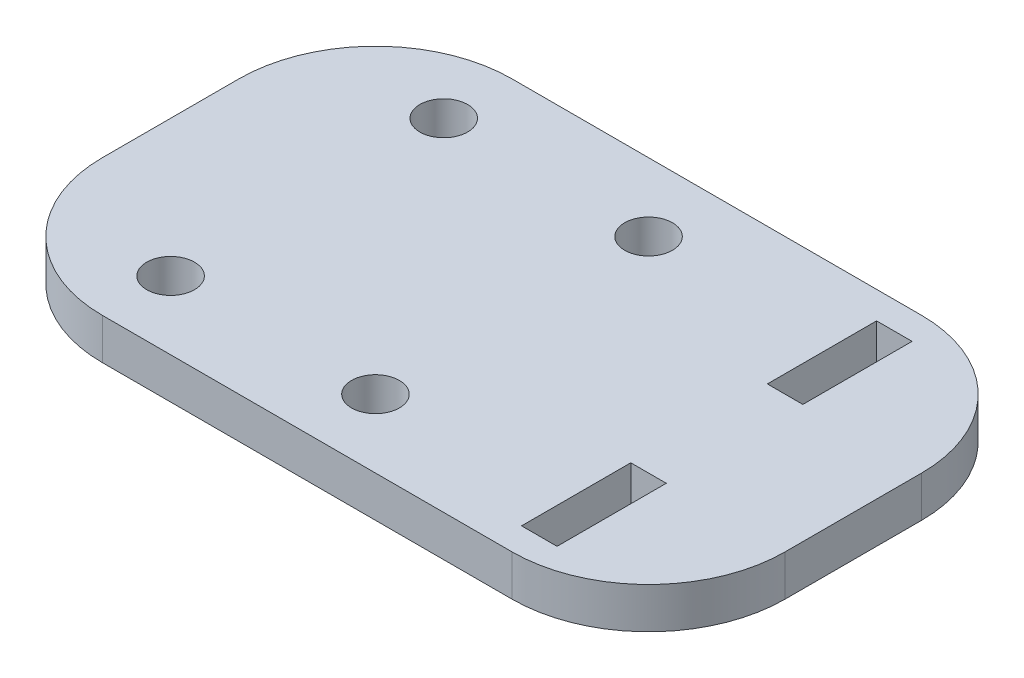
ISO-10303-21;
HEADER;
FILE_DESCRIPTION(('STEP AP214'),'2;1');
FILE_NAME('part.step','',(''),(''),'','','');
FILE_SCHEMA(('AUTOMOTIVE_DESIGN { 1 0 10303 214 1 1 1 1 }'));
ENDSEC;
DATA;
#1=APPLICATION_CONTEXT('core data for automotive mechanical design processes');
#2=APPLICATION_PROTOCOL_DEFINITION('international standard','automotive_design',2000,#1);
#3=PRODUCT_CONTEXT('',#1,'mechanical');
#4=PRODUCT('Part','Part','',(#3));
#5=PRODUCT_RELATED_PRODUCT_CATEGORY('part','',(#4));
#6=PRODUCT_DEFINITION_FORMATION('','',#4);
#7=PRODUCT_DEFINITION_CONTEXT('part definition',#1,'design');
#8=PRODUCT_DEFINITION('design','',#6,#7);
#9=PRODUCT_DEFINITION_SHAPE('','',#8);
#10=(LENGTH_UNIT() NAMED_UNIT(*) SI_UNIT(.MILLI.,.METRE.));
#11=(NAMED_UNIT(*) PLANE_ANGLE_UNIT() SI_UNIT($,.RADIAN.));
#12=(NAMED_UNIT(*) SI_UNIT($,.STERADIAN.) SOLID_ANGLE_UNIT());
#13=UNCERTAINTY_MEASURE_WITH_UNIT(LENGTH_MEASURE(1.E-05),#10,'distance_accuracy_value','');
#14=(GEOMETRIC_REPRESENTATION_CONTEXT(3) GLOBAL_UNCERTAINTY_ASSIGNED_CONTEXT((#13)) GLOBAL_UNIT_ASSIGNED_CONTEXT((#10,
#11,#12)) REPRESENTATION_CONTEXT('',''));
#15=CARTESIAN_POINT('',(0.,0.,0.));
#16=DIRECTION('',(0.,0.,1.));
#17=DIRECTION('',(1.,0.,0.));
#18=AXIS2_PLACEMENT_3D('',#15,#16,#17);
#19=CARTESIAN_POINT('',(0.,3.,0.));
#20=DIRECTION('',(0.,1.,0.));
#21=DIRECTION('',(0.,0.,1.));
#22=AXIS2_PLACEMENT_3D('',#19,#20,#21);
#23=PLANE('',#22);
#24=CARTESIAN_POINT('',(0.,3.,10.));
#25=DIRECTION('',(0.,1.,0.));
#26=DIRECTION('',(0.,0.,-1.));
#27=AXIS2_PLACEMENT_3D('',#24,#25,#26);
#28=CIRCLE('',#27,1.75);
#29=CARTESIAN_POINT('',(0.,3.,8.25));
#30=VERTEX_POINT('',#29);
#31=EDGE_CURVE('E538',#30,#30,#28,.T.);
#32=ORIENTED_EDGE('',*,*,#31,.F.);
#33=EDGE_LOOP('',(#32));
#34=FACE_BOUND('',#33,.T.);
#35=DIRECTION('',(-1.,0.,0.));
#36=VECTOR('',#35,1.);
#37=CARTESIAN_POINT('',(16.3,3.,5.));
#38=LINE('',#37,#36);
#39=CARTESIAN_POINT('',(16.3,3.,5.));
#40=VERTEX_POINT('',#39);
#41=CARTESIAN_POINT('',(13.7,3.,5.));
#42=VERTEX_POINT('',#41);
#43=EDGE_CURVE('E157',#40,#42,#38,.T.);
#44=ORIENTED_EDGE('',*,*,#43,.F.);
#45=DIRECTION('',(0.,0.,-1.));
#46=VECTOR('',#45,1.);
#47=CARTESIAN_POINT('',(16.3,3.,13.));
#48=LINE('',#47,#46);
#49=CARTESIAN_POINT('',(16.3,3.,13.));
#50=VERTEX_POINT('',#49);
#51=EDGE_CURVE('E147',#50,#40,#48,.T.);
#52=ORIENTED_EDGE('',*,*,#51,.F.);
#53=DIRECTION('',(1.,0.,0.));
#54=VECTOR('',#53,1.);
#55=CARTESIAN_POINT('',(16.3,3.,13.));
#56=LINE('',#55,#54);
#57=CARTESIAN_POINT('',(13.7,3.,13.));
#58=VERTEX_POINT('',#57);
#59=EDGE_CURVE('E173',#58,#50,#56,.T.);
#60=ORIENTED_EDGE('',*,*,#59,.F.);
#61=DIRECTION('',(0.,0.,1.));
#62=VECTOR('',#61,1.);
#63=CARTESIAN_POINT('',(13.7,3.,13.));
#64=LINE('',#63,#62);
#65=EDGE_CURVE('E171',#42,#58,#64,.T.);
#66=ORIENTED_EDGE('',*,*,#65,.F.);
#67=EDGE_LOOP('',(#44,#52,#60,#66));
#68=FACE_BOUND('',#67,.T.);
#69=DIRECTION('',(-1.,0.,0.));
#70=VECTOR('',#69,1.);
#71=CARTESIAN_POINT('',(16.3,3.,-13.));
#72=LINE('',#71,#70);
#73=CARTESIAN_POINT('',(16.3,3.,-13.));
#74=VERTEX_POINT('',#73);
#75=CARTESIAN_POINT('',(13.7,3.,-13.));
#76=VERTEX_POINT('',#75);
#77=EDGE_CURVE('E199',#74,#76,#72,.T.);
#78=ORIENTED_EDGE('',*,*,#77,.F.);
#79=DIRECTION('',(0.,0.,-1.));
#80=VECTOR('',#79,1.);
#81=CARTESIAN_POINT('',(16.3,3.,-13.));
#82=LINE('',#81,#80);
#83=CARTESIAN_POINT('',(16.3,3.,-5.));
#84=VERTEX_POINT('',#83);
#85=EDGE_CURVE('E197',#84,#74,#82,.T.);
#86=ORIENTED_EDGE('',*,*,#85,.F.);
#87=DIRECTION('',(1.,0.,0.));
#88=VECTOR('',#87,1.);
#89=CARTESIAN_POINT('',(16.3,3.,-5.));
#90=LINE('',#89,#88);
#91=CARTESIAN_POINT('',(13.7,3.,-5.));
#92=VERTEX_POINT('',#91);
#93=EDGE_CURVE('E205',#92,#84,#90,.T.);
#94=ORIENTED_EDGE('',*,*,#93,.F.);
#95=DIRECTION('',(0.,0.,1.));
#96=VECTOR('',#95,1.);
#97=CARTESIAN_POINT('',(13.7,3.,-13.));
#98=LINE('',#97,#96);
#99=EDGE_CURVE('E202',#76,#92,#98,.T.);
#100=ORIENTED_EDGE('',*,*,#99,.F.);
#101=EDGE_LOOP('',(#78,#86,#94,#100));
#102=FACE_BOUND('',#101,.T.);
#103=DIRECTION('',(-1.,0.,0.));
#104=VECTOR('',#103,1.);
#105=CARTESIAN_POINT('',(-25.,3.,-15.));
#106=LINE('',#105,#104);
#107=CARTESIAN_POINT('',(15.,3.,-15.));
#108=VERTEX_POINT('',#107);
#109=CARTESIAN_POINT('',(-15.,3.,-15.));
#110=VERTEX_POINT('',#109);
#111=EDGE_CURVE('E236',#108,#110,#106,.T.);
#112=ORIENTED_EDGE('',*,*,#111,.T.);
#113=CARTESIAN_POINT('',(-15.,3.,-5.));
#114=DIRECTION('',(0.,1.,0.));
#115=DIRECTION('',(0.,0.,1.));
#116=AXIS2_PLACEMENT_3D('',#113,#114,#115);
#117=CIRCLE('',#116,10.);
#118=CARTESIAN_POINT('',(-25.,3.,-5.));
#119=VERTEX_POINT('',#118);
#120=EDGE_CURVE('E271',#110,#119,#117,.T.);
#121=ORIENTED_EDGE('',*,*,#120,.T.);
#122=DIRECTION('',(0.,0.,1.));
#123=VECTOR('',#122,1.);
#124=CARTESIAN_POINT('',(-25.,3.,-15.));
#125=LINE('',#124,#123);
#126=CARTESIAN_POINT('',(-25.,3.,5.));
#127=VERTEX_POINT('',#126);
#128=EDGE_CURVE('E228',#119,#127,#125,.T.);
#129=ORIENTED_EDGE('',*,*,#128,.T.);
#130=CARTESIAN_POINT('',(-15.,3.,5.));
#131=DIRECTION('',(0.,1.,0.));
#132=DIRECTION('',(0.,0.,1.));
#133=AXIS2_PLACEMENT_3D('',#130,#131,#132);
#134=CIRCLE('',#133,10.);
#135=CARTESIAN_POINT('',(-15.,3.,15.));
#136=VERTEX_POINT('',#135);
#137=EDGE_CURVE('E269',#127,#136,#134,.T.);
#138=ORIENTED_EDGE('',*,*,#137,.T.);
#139=DIRECTION('',(1.,0.,0.));
#140=VECTOR('',#139,1.);
#141=CARTESIAN_POINT('',(-25.,3.,15.));
#142=LINE('',#141,#140);
#143=CARTESIAN_POINT('',(15.,3.,15.));
#144=VERTEX_POINT('',#143);
#145=EDGE_CURVE('E231',#136,#144,#142,.T.);
#146=ORIENTED_EDGE('',*,*,#145,.T.);
#147=CARTESIAN_POINT('',(15.,3.,5.));
#148=DIRECTION('',(0.,1.,0.));
#149=DIRECTION('',(0.,0.,1.));
#150=AXIS2_PLACEMENT_3D('',#147,#148,#149);
#151=CIRCLE('',#150,10.);
#152=CARTESIAN_POINT('',(25.,3.,5.));
#153=VERTEX_POINT('',#152);
#154=EDGE_CURVE('E53',#144,#153,#151,.T.);
#155=ORIENTED_EDGE('',*,*,#154,.T.);
#156=DIRECTION('',(0.,0.,-1.));
#157=VECTOR('',#156,1.);
#158=CARTESIAN_POINT('',(25.,3.,-15.));
#159=LINE('',#158,#157);
#160=CARTESIAN_POINT('',(25.,3.,-5.));
#161=VERTEX_POINT('',#160);
#162=EDGE_CURVE('E234',#153,#161,#159,.T.);
#163=ORIENTED_EDGE('',*,*,#162,.T.);
#164=CARTESIAN_POINT('',(15.,3.,-5.));
#165=DIRECTION('',(0.,1.,0.));
#166=DIRECTION('',(0.,0.,1.));
#167=AXIS2_PLACEMENT_3D('',#164,#165,#166);
#168=CIRCLE('',#167,10.);
#169=EDGE_CURVE('E267',#161,#108,#168,.T.);
#170=ORIENTED_EDGE('',*,*,#169,.T.);
#171=EDGE_LOOP('',(#112,#121,#129,#138,#146,#155,#163,#170));
#172=FACE_BOUND('',#171,.T.);
#173=CARTESIAN_POINT('',(-15.,3.,-10.));
#174=DIRECTION('',(0.,1.,0.));
#175=DIRECTION('',(0.,0.,1.));
#176=AXIS2_PLACEMENT_3D('',#173,#174,#175);
#177=CIRCLE('',#176,1.75);
#178=CARTESIAN_POINT('',(-15.,3.,-8.25));
#179=VERTEX_POINT('',#178);
#180=EDGE_CURVE('E191',#179,#179,#177,.T.);
#181=ORIENTED_EDGE('',*,*,#180,.F.);
#182=EDGE_LOOP('',(#181));
#183=FACE_BOUND('',#182,.T.);
#184=CARTESIAN_POINT('',(0.,3.,-10.));
#185=DIRECTION('',(0.,1.,0.));
#186=DIRECTION('',(0.,0.,1.));
#187=AXIS2_PLACEMENT_3D('',#184,#185,#186);
#188=CIRCLE('',#187,1.75);
#189=CARTESIAN_POINT('',(0.,3.,-8.25));
#190=VERTEX_POINT('',#189);
#191=EDGE_CURVE('E180',#190,#190,#188,.T.);
#192=ORIENTED_EDGE('',*,*,#191,.F.);
#193=EDGE_LOOP('',(#192));
#194=FACE_BOUND('',#193,.T.);
#195=CARTESIAN_POINT('',(-15.,3.,10.));
#196=DIRECTION('',(0.,1.,0.));
#197=DIRECTION('',(0.,0.,-1.));
#198=AXIS2_PLACEMENT_3D('',#195,#196,#197);
#199=CIRCLE('',#198,1.75);
#200=CARTESIAN_POINT('',(-15.,3.,8.25));
#201=VERTEX_POINT('',#200);
#202=EDGE_CURVE('E532',#201,#201,#199,.T.);
#203=ORIENTED_EDGE('',*,*,#202,.F.);
#204=EDGE_LOOP('',(#203));
#205=FACE_BOUND('',#204,.T.);
#206=ADVANCED_FACE('F33',(#34,#68,#102,#172,#183,#194,#205),#23,.T.);
#207=CARTESIAN_POINT('',(0.,0.,0.));
#208=DIRECTION('',(0.,1.,0.));
#209=DIRECTION('',(0.,0.,1.));
#210=AXIS2_PLACEMENT_3D('',#207,#208,#209);
#211=PLANE('',#210);
#212=CARTESIAN_POINT('',(0.,0.,10.));
#213=DIRECTION('',(0.,1.,0.));
#214=DIRECTION('',(0.,0.,-1.));
#215=AXIS2_PLACEMENT_3D('',#212,#213,#214);
#216=CIRCLE('',#215,1.75);
#217=CARTESIAN_POINT('',(0.,0.,8.25));
#218=VERTEX_POINT('',#217);
#219=EDGE_CURVE('E535',#218,#218,#216,.T.);
#220=ORIENTED_EDGE('',*,*,#219,.T.);
#221=EDGE_LOOP('',(#220));
#222=FACE_BOUND('',#221,.T.);
#223=DIRECTION('',(0.,0.,-1.));
#224=VECTOR('',#223,1.);
#225=CARTESIAN_POINT('',(16.3,0.,13.));
#226=LINE('',#225,#224);
#227=CARTESIAN_POINT('',(16.3,0.,13.));
#228=VERTEX_POINT('',#227);
#229=CARTESIAN_POINT('',(16.3,0.,5.));
#230=VERTEX_POINT('',#229);
#231=EDGE_CURVE('E178',#228,#230,#226,.T.);
#232=ORIENTED_EDGE('',*,*,#231,.T.);
#233=DIRECTION('',(-1.,0.,0.));
#234=VECTOR('',#233,1.);
#235=CARTESIAN_POINT('',(16.3,0.,5.));
#236=LINE('',#235,#234);
#237=CARTESIAN_POINT('',(13.7,0.,5.));
#238=VERTEX_POINT('',#237);
#239=EDGE_CURVE('E164',#230,#238,#236,.T.);
#240=ORIENTED_EDGE('',*,*,#239,.T.);
#241=DIRECTION('',(0.,0.,1.));
#242=VECTOR('',#241,1.);
#243=CARTESIAN_POINT('',(13.7,0.,13.));
#244=LINE('',#243,#242);
#245=CARTESIAN_POINT('',(13.7,0.,13.));
#246=VERTEX_POINT('',#245);
#247=EDGE_CURVE('E182',#238,#246,#244,.T.);
#248=ORIENTED_EDGE('',*,*,#247,.T.);
#249=DIRECTION('',(1.,0.,0.));
#250=VECTOR('',#249,1.);
#251=CARTESIAN_POINT('',(16.3,0.,13.));
#252=LINE('',#251,#250);
#253=EDGE_CURVE('E158',#246,#228,#252,.T.);
#254=ORIENTED_EDGE('',*,*,#253,.T.);
#255=EDGE_LOOP('',(#232,#240,#248,#254));
#256=FACE_BOUND('',#255,.T.);
#257=DIRECTION('',(0.,0.,-1.));
#258=VECTOR('',#257,1.);
#259=CARTESIAN_POINT('',(16.3,0.,-13.));
#260=LINE('',#259,#258);
#261=CARTESIAN_POINT('',(16.3,0.,-5.));
#262=VERTEX_POINT('',#261);
#263=CARTESIAN_POINT('',(16.3,0.,-13.));
#264=VERTEX_POINT('',#263);
#265=EDGE_CURVE('E194',#262,#264,#260,.T.);
#266=ORIENTED_EDGE('',*,*,#265,.T.);
#267=DIRECTION('',(-1.,0.,0.));
#268=VECTOR('',#267,1.);
#269=CARTESIAN_POINT('',(16.3,0.,-13.));
#270=LINE('',#269,#268);
#271=CARTESIAN_POINT('',(13.7,0.,-13.));
#272=VERTEX_POINT('',#271);
#273=EDGE_CURVE('E210',#264,#272,#270,.T.);
#274=ORIENTED_EDGE('',*,*,#273,.T.);
#275=DIRECTION('',(0.,0.,1.));
#276=VECTOR('',#275,1.);
#277=CARTESIAN_POINT('',(13.7,0.,-13.));
#278=LINE('',#277,#276);
#279=CARTESIAN_POINT('',(13.7,0.,-5.));
#280=VERTEX_POINT('',#279);
#281=EDGE_CURVE('E213',#272,#280,#278,.T.);
#282=ORIENTED_EDGE('',*,*,#281,.T.);
#283=DIRECTION('',(1.,0.,0.));
#284=VECTOR('',#283,1.);
#285=CARTESIAN_POINT('',(16.3,0.,-5.));
#286=LINE('',#285,#284);
#287=EDGE_CURVE('E200',#280,#262,#286,.T.);
#288=ORIENTED_EDGE('',*,*,#287,.T.);
#289=EDGE_LOOP('',(#266,#274,#282,#288));
#290=FACE_BOUND('',#289,.T.);
#291=DIRECTION('',(0.,0.,1.));
#292=VECTOR('',#291,1.);
#293=CARTESIAN_POINT('',(-25.,0.,-15.));
#294=LINE('',#293,#292);
#295=CARTESIAN_POINT('',(-25.,0.,-5.));
#296=VERTEX_POINT('',#295);
#297=CARTESIAN_POINT('',(-25.,0.,5.));
#298=VERTEX_POINT('',#297);
#299=EDGE_CURVE('E227',#296,#298,#294,.T.);
#300=ORIENTED_EDGE('',*,*,#299,.F.);
#301=CARTESIAN_POINT('',(-15.,0.,-5.));
#302=DIRECTION('',(0.,1.,0.));
#303=DIRECTION('',(0.,0.,1.));
#304=AXIS2_PLACEMENT_3D('',#301,#302,#303);
#305=CIRCLE('',#304,10.);
#306=CARTESIAN_POINT('',(-15.,0.,-15.));
#307=VERTEX_POINT('',#306);
#308=EDGE_CURVE('E259',#296,#307,#305,.F.);
#309=ORIENTED_EDGE('',*,*,#308,.T.);
#310=DIRECTION('',(-1.,0.,0.));
#311=VECTOR('',#310,1.);
#312=CARTESIAN_POINT('',(-25.,0.,-15.));
#313=LINE('',#312,#311);
#314=CARTESIAN_POINT('',(15.,0.,-15.));
#315=VERTEX_POINT('',#314);
#316=EDGE_CURVE('E232',#315,#307,#313,.T.);
#317=ORIENTED_EDGE('',*,*,#316,.F.);
#318=CARTESIAN_POINT('',(15.,0.,-5.));
#319=DIRECTION('',(0.,1.,0.));
#320=DIRECTION('',(0.,0.,1.));
#321=AXIS2_PLACEMENT_3D('',#318,#319,#320);
#322=CIRCLE('',#321,10.);
#323=CARTESIAN_POINT('',(25.,0.,-5.));
#324=VERTEX_POINT('',#323);
#325=EDGE_CURVE('E255',#315,#324,#322,.F.);
#326=ORIENTED_EDGE('',*,*,#325,.T.);
#327=DIRECTION('',(0.,0.,-1.));
#328=VECTOR('',#327,1.);
#329=CARTESIAN_POINT('',(25.,0.,-15.));
#330=LINE('',#329,#328);
#331=CARTESIAN_POINT('',(25.,0.,5.));
#332=VERTEX_POINT('',#331);
#333=EDGE_CURVE('E245',#332,#324,#330,.T.);
#334=ORIENTED_EDGE('',*,*,#333,.F.);
#335=CARTESIAN_POINT('',(15.,0.,5.));
#336=DIRECTION('',(0.,1.,0.));
#337=DIRECTION('',(0.,0.,1.));
#338=AXIS2_PLACEMENT_3D('',#335,#336,#337);
#339=CIRCLE('',#338,10.);
#340=CARTESIAN_POINT('',(15.,0.,15.));
#341=VERTEX_POINT('',#340);
#342=EDGE_CURVE('E253',#332,#341,#339,.F.);
#343=ORIENTED_EDGE('',*,*,#342,.T.);
#344=DIRECTION('',(1.,0.,0.));
#345=VECTOR('',#344,1.);
#346=CARTESIAN_POINT('',(-25.,0.,15.));
#347=LINE('',#346,#345);
#348=CARTESIAN_POINT('',(-15.,0.,15.));
#349=VERTEX_POINT('',#348);
#350=EDGE_CURVE('E242',#349,#341,#347,.T.);
#351=ORIENTED_EDGE('',*,*,#350,.F.);
#352=CARTESIAN_POINT('',(-15.,0.,5.));
#353=DIRECTION('',(0.,1.,0.));
#354=DIRECTION('',(0.,0.,1.));
#355=AXIS2_PLACEMENT_3D('',#352,#353,#354);
#356=CIRCLE('',#355,10.);
#357=EDGE_CURVE('E257',#349,#298,#356,.F.);
#358=ORIENTED_EDGE('',*,*,#357,.T.);
#359=EDGE_LOOP('',(#300,#309,#317,#326,#334,#343,#351,#358));
#360=FACE_BOUND('',#359,.T.);
#361=CARTESIAN_POINT('',(-15.,0.,-10.));
#362=DIRECTION('',(0.,1.,0.));
#363=DIRECTION('',(0.,0.,1.));
#364=AXIS2_PLACEMENT_3D('',#361,#362,#363);
#365=CIRCLE('',#364,1.75);
#366=CARTESIAN_POINT('',(-15.,0.,-8.25));
#367=VERTEX_POINT('',#366);
#368=EDGE_CURVE('E165',#367,#367,#365,.T.);
#369=ORIENTED_EDGE('',*,*,#368,.T.);
#370=EDGE_LOOP('',(#369));
#371=FACE_BOUND('',#370,.T.);
#372=CARTESIAN_POINT('',(0.,0.,-10.));
#373=DIRECTION('',(0.,1.,0.));
#374=DIRECTION('',(0.,0.,1.));
#375=AXIS2_PLACEMENT_3D('',#372,#373,#374);
#376=CIRCLE('',#375,1.75);
#377=CARTESIAN_POINT('',(0.,0.,-8.25));
#378=VERTEX_POINT('',#377);
#379=EDGE_CURVE('E527',#378,#378,#376,.T.);
#380=ORIENTED_EDGE('',*,*,#379,.T.);
#381=EDGE_LOOP('',(#380));
#382=FACE_BOUND('',#381,.T.);
#383=CARTESIAN_POINT('',(-15.,0.,10.));
#384=DIRECTION('',(0.,1.,0.));
#385=DIRECTION('',(0.,0.,-1.));
#386=AXIS2_PLACEMENT_3D('',#383,#384,#385);
#387=CIRCLE('',#386,1.75);
#388=CARTESIAN_POINT('',(-15.,0.,8.25));
#389=VERTEX_POINT('',#388);
#390=EDGE_CURVE('E530',#389,#389,#387,.T.);
#391=ORIENTED_EDGE('',*,*,#390,.T.);
#392=EDGE_LOOP('',(#391));
#393=FACE_BOUND('',#392,.T.);
#394=ADVANCED_FACE('F284',(#222,#256,#290,#360,#371,#382,#393),#211,.F.);
#395=CARTESIAN_POINT('',(-25.,3.,-15.));
#396=DIRECTION('',(1.,0.,0.));
#397=DIRECTION('',(0.,0.,-1.));
#398=AXIS2_PLACEMENT_3D('',#395,#396,#397);
#399=PLANE('',#398);
#400=ORIENTED_EDGE('',*,*,#128,.F.);
#401=DIRECTION('',(0.,-1.,0.));
#402=VECTOR('',#401,1.);
#403=CARTESIAN_POINT('',(-25.,3.,-5.));
#404=LINE('',#403,#402);
#405=EDGE_CURVE('E250',#119,#296,#404,.T.);
#406=ORIENTED_EDGE('',*,*,#405,.T.);
#407=ORIENTED_EDGE('',*,*,#299,.T.);
#408=DIRECTION('',(0.,-1.,0.));
#409=VECTOR('',#408,1.);
#410=CARTESIAN_POINT('',(-25.,3.,5.));
#411=LINE('',#410,#409);
#412=EDGE_CURVE('E239',#298,#127,#411,.F.);
#413=ORIENTED_EDGE('',*,*,#412,.T.);
#414=EDGE_LOOP('',(#400,#406,#407,#413));
#415=FACE_BOUND('',#414,.T.);
#416=ADVANCED_FACE('F303',(#415),#399,.F.);
#417=CARTESIAN_POINT('',(-25.,3.,15.));
#418=DIRECTION('',(0.,0.,-1.));
#419=DIRECTION('',(-1.,0.,0.));
#420=AXIS2_PLACEMENT_3D('',#417,#418,#419);
#421=PLANE('',#420);
#422=ORIENTED_EDGE('',*,*,#145,.F.);
#423=DIRECTION('',(0.,-1.,0.));
#424=VECTOR('',#423,1.);
#425=CARTESIAN_POINT('',(-15.,3.,15.));
#426=LINE('',#425,#424);
#427=EDGE_CURVE('E275',#136,#349,#426,.T.);
#428=ORIENTED_EDGE('',*,*,#427,.T.);
#429=ORIENTED_EDGE('',*,*,#350,.T.);
#430=DIRECTION('',(0.,-1.,0.));
#431=VECTOR('',#430,1.);
#432=CARTESIAN_POINT('',(15.,3.,15.));
#433=LINE('',#432,#431);
#434=EDGE_CURVE('E273',#341,#144,#433,.F.);
#435=ORIENTED_EDGE('',*,*,#434,.T.);
#436=EDGE_LOOP('',(#422,#428,#429,#435));
#437=FACE_BOUND('',#436,.T.);
#438=ADVANCED_FACE('F311',(#437),#421,.F.);
#439=CARTESIAN_POINT('',(25.,3.,-15.));
#440=DIRECTION('',(-1.,0.,0.));
#441=DIRECTION('',(0.,0.,1.));
#442=AXIS2_PLACEMENT_3D('',#439,#440,#441);
#443=PLANE('',#442);
#444=ORIENTED_EDGE('',*,*,#333,.T.);
#445=DIRECTION('',(0.,-1.,0.));
#446=VECTOR('',#445,1.);
#447=CARTESIAN_POINT('',(25.,3.,-5.));
#448=LINE('',#447,#446);
#449=EDGE_CURVE('E11',#324,#161,#448,.F.);
#450=ORIENTED_EDGE('',*,*,#449,.T.);
#451=ORIENTED_EDGE('',*,*,#162,.F.);
#452=DIRECTION('',(0.,-1.,0.));
#453=VECTOR('',#452,1.);
#454=CARTESIAN_POINT('',(25.,3.,5.));
#455=LINE('',#454,#453);
#456=EDGE_CURVE('E41',#153,#332,#455,.T.);
#457=ORIENTED_EDGE('',*,*,#456,.T.);
#458=EDGE_LOOP('',(#444,#450,#451,#457));
#459=FACE_BOUND('',#458,.T.);
#460=ADVANCED_FACE('F280',(#459),#443,.F.);
#461=CARTESIAN_POINT('',(-25.,3.,-15.));
#462=DIRECTION('',(0.,0.,1.));
#463=DIRECTION('',(1.,0.,0.));
#464=AXIS2_PLACEMENT_3D('',#461,#462,#463);
#465=PLANE('',#464);
#466=ORIENTED_EDGE('',*,*,#316,.T.);
#467=DIRECTION('',(0.,-1.,0.));
#468=VECTOR('',#467,1.);
#469=CARTESIAN_POINT('',(-15.,3.,-15.));
#470=LINE('',#469,#468);
#471=EDGE_CURVE('E264',#307,#110,#470,.F.);
#472=ORIENTED_EDGE('',*,*,#471,.T.);
#473=ORIENTED_EDGE('',*,*,#111,.F.);
#474=DIRECTION('',(0.,-1.,0.));
#475=VECTOR('',#474,1.);
#476=CARTESIAN_POINT('',(15.,3.,-15.));
#477=LINE('',#476,#475);
#478=EDGE_CURVE('E261',#108,#315,#477,.T.);
#479=ORIENTED_EDGE('',*,*,#478,.T.);
#480=EDGE_LOOP('',(#466,#472,#473,#479));
#481=FACE_BOUND('',#480,.T.);
#482=ADVANCED_FACE('F294',(#481),#465,.F.);
#483=CARTESIAN_POINT('',(16.3,3.,-13.));
#484=DIRECTION('',(-1.,0.,0.));
#485=DIRECTION('',(0.,0.,1.));
#486=AXIS2_PLACEMENT_3D('',#483,#484,#485);
#487=PLANE('',#486);
#488=ORIENTED_EDGE('',*,*,#265,.F.);
#489=DIRECTION('',(0.,-1.,0.));
#490=VECTOR('',#489,1.);
#491=CARTESIAN_POINT('',(16.3,3.,-5.));
#492=LINE('',#491,#490);
#493=EDGE_CURVE('E207',#84,#262,#492,.T.);
#494=ORIENTED_EDGE('',*,*,#493,.F.);
#495=ORIENTED_EDGE('',*,*,#85,.T.);
#496=DIRECTION('',(0.,-1.,0.));
#497=VECTOR('',#496,1.);
#498=CARTESIAN_POINT('',(16.3,3.,-13.));
#499=LINE('',#498,#497);
#500=EDGE_CURVE('E224',#74,#264,#499,.T.);
#501=ORIENTED_EDGE('',*,*,#500,.T.);
#502=EDGE_LOOP('',(#488,#494,#495,#501));
#503=FACE_BOUND('',#502,.T.);
#504=ADVANCED_FACE('F327',(#503),#487,.T.);
#505=CARTESIAN_POINT('',(16.3,3.,-13.));
#506=DIRECTION('',(0.,0.,1.));
#507=DIRECTION('',(1.,0.,0.));
#508=AXIS2_PLACEMENT_3D('',#505,#506,#507);
#509=PLANE('',#508);
#510=ORIENTED_EDGE('',*,*,#273,.F.);
#511=ORIENTED_EDGE('',*,*,#500,.F.);
#512=ORIENTED_EDGE('',*,*,#77,.T.);
#513=DIRECTION('',(0.,-1.,0.));
#514=VECTOR('',#513,1.);
#515=CARTESIAN_POINT('',(13.7,3.,-13.));
#516=LINE('',#515,#514);
#517=EDGE_CURVE('E222',#76,#272,#516,.T.);
#518=ORIENTED_EDGE('',*,*,#517,.T.);
#519=EDGE_LOOP('',(#510,#511,#512,#518));
#520=FACE_BOUND('',#519,.T.);
#521=ADVANCED_FACE('F448',(#520),#509,.T.);
#522=CARTESIAN_POINT('',(13.7,3.,-13.));
#523=DIRECTION('',(1.,0.,0.));
#524=DIRECTION('',(0.,0.,-1.));
#525=AXIS2_PLACEMENT_3D('',#522,#523,#524);
#526=PLANE('',#525);
#527=ORIENTED_EDGE('',*,*,#281,.F.);
#528=ORIENTED_EDGE('',*,*,#517,.F.);
#529=ORIENTED_EDGE('',*,*,#99,.T.);
#530=DIRECTION('',(0.,-1.,0.));
#531=VECTOR('',#530,1.);
#532=CARTESIAN_POINT('',(13.7,3.,-5.));
#533=LINE('',#532,#531);
#534=EDGE_CURVE('E220',#92,#280,#533,.T.);
#535=ORIENTED_EDGE('',*,*,#534,.T.);
#536=EDGE_LOOP('',(#527,#528,#529,#535));
#537=FACE_BOUND('',#536,.T.);
#538=ADVANCED_FACE('F439',(#537),#526,.T.);
#539=CARTESIAN_POINT('',(16.3,3.,-5.));
#540=DIRECTION('',(0.,0.,-1.));
#541=DIRECTION('',(-1.,0.,0.));
#542=AXIS2_PLACEMENT_3D('',#539,#540,#541);
#543=PLANE('',#542);
#544=ORIENTED_EDGE('',*,*,#287,.F.);
#545=ORIENTED_EDGE('',*,*,#534,.F.);
#546=ORIENTED_EDGE('',*,*,#93,.T.);
#547=ORIENTED_EDGE('',*,*,#493,.T.);
#548=EDGE_LOOP('',(#544,#545,#546,#547));
#549=FACE_BOUND('',#548,.T.);
#550=ADVANCED_FACE('F430',(#549),#543,.T.);
#551=CARTESIAN_POINT('',(-15.,3.,-10.));
#552=DIRECTION('',(0.,-1.,0.));
#553=DIRECTION('',(0.,0.,-1.));
#554=AXIS2_PLACEMENT_3D('',#551,#552,#553);
#555=CYLINDRICAL_SURFACE('',#554,1.75);
#556=ORIENTED_EDGE('',*,*,#180,.T.);
#557=EDGE_LOOP('',(#556));
#558=FACE_BOUND('',#557,.T.);
#559=ORIENTED_EDGE('',*,*,#368,.F.);
#560=EDGE_LOOP('',(#559));
#561=FACE_BOUND('',#560,.T.);
#562=ADVANCED_FACE('F422',(#558,#561),#555,.F.);
#563=CARTESIAN_POINT('',(16.3,3.,13.));
#564=DIRECTION('',(-1.,0.,0.));
#565=DIRECTION('',(0.,0.,1.));
#566=AXIS2_PLACEMENT_3D('',#563,#564,#565);
#567=PLANE('',#566);
#568=ORIENTED_EDGE('',*,*,#231,.F.);
#569=DIRECTION('',(0.,-1.,0.));
#570=VECTOR('',#569,1.);
#571=CARTESIAN_POINT('',(16.3,3.,13.));
#572=LINE('',#571,#570);
#573=EDGE_CURVE('E153',#50,#228,#572,.T.);
#574=ORIENTED_EDGE('',*,*,#573,.F.);
#575=ORIENTED_EDGE('',*,*,#51,.T.);
#576=DIRECTION('',(0.,-1.,0.));
#577=VECTOR('',#576,1.);
#578=CARTESIAN_POINT('',(16.3,3.,5.));
#579=LINE('',#578,#577);
#580=EDGE_CURVE('E150',#40,#230,#579,.T.);
#581=ORIENTED_EDGE('',*,*,#580,.T.);
#582=EDGE_LOOP('',(#568,#574,#575,#581));
#583=FACE_BOUND('',#582,.T.);
#584=ADVANCED_FACE('F149',(#583),#567,.T.);
#585=CARTESIAN_POINT('',(16.3,3.,5.));
#586=DIRECTION('',(0.,0.,1.));
#587=DIRECTION('',(1.,0.,0.));
#588=AXIS2_PLACEMENT_3D('',#585,#586,#587);
#589=PLANE('',#588);
#590=ORIENTED_EDGE('',*,*,#239,.F.);
#591=ORIENTED_EDGE('',*,*,#580,.F.);
#592=ORIENTED_EDGE('',*,*,#43,.T.);
#593=DIRECTION('',(0.,-1.,0.));
#594=VECTOR('',#593,1.);
#595=CARTESIAN_POINT('',(13.7,3.,5.));
#596=LINE('',#595,#594);
#597=EDGE_CURVE('E166',#42,#238,#596,.T.);
#598=ORIENTED_EDGE('',*,*,#597,.T.);
#599=EDGE_LOOP('',(#590,#591,#592,#598));
#600=FACE_BOUND('',#599,.T.);
#601=ADVANCED_FACE('F161',(#600),#589,.T.);
#602=CARTESIAN_POINT('',(13.7,3.,13.));
#603=DIRECTION('',(1.,0.,0.));
#604=DIRECTION('',(0.,0.,-1.));
#605=AXIS2_PLACEMENT_3D('',#602,#603,#604);
#606=PLANE('',#605);
#607=ORIENTED_EDGE('',*,*,#247,.F.);
#608=ORIENTED_EDGE('',*,*,#597,.F.);
#609=ORIENTED_EDGE('',*,*,#65,.T.);
#610=DIRECTION('',(0.,-1.,0.));
#611=VECTOR('',#610,1.);
#612=CARTESIAN_POINT('',(13.7,3.,13.));
#613=LINE('',#612,#611);
#614=EDGE_CURVE('E188',#58,#246,#613,.T.);
#615=ORIENTED_EDGE('',*,*,#614,.T.);
#616=EDGE_LOOP('',(#607,#608,#609,#615));
#617=FACE_BOUND('',#616,.T.);
#618=ADVANCED_FACE('F398',(#617),#606,.T.);
#619=CARTESIAN_POINT('',(16.3,3.,13.));
#620=DIRECTION('',(0.,0.,-1.));
#621=DIRECTION('',(-1.,0.,0.));
#622=AXIS2_PLACEMENT_3D('',#619,#620,#621);
#623=PLANE('',#622);
#624=ORIENTED_EDGE('',*,*,#253,.F.);
#625=ORIENTED_EDGE('',*,*,#614,.F.);
#626=ORIENTED_EDGE('',*,*,#59,.T.);
#627=ORIENTED_EDGE('',*,*,#573,.T.);
#628=EDGE_LOOP('',(#624,#625,#626,#627));
#629=FACE_BOUND('',#628,.T.);
#630=ADVANCED_FACE('F389',(#629),#623,.T.);
#631=CARTESIAN_POINT('',(0.,3.,-10.));
#632=DIRECTION('',(0.,-1.,0.));
#633=DIRECTION('',(0.,0.,-1.));
#634=AXIS2_PLACEMENT_3D('',#631,#632,#633);
#635=CYLINDRICAL_SURFACE('',#634,1.75);
#636=ORIENTED_EDGE('',*,*,#191,.T.);
#637=EDGE_LOOP('',(#636));
#638=FACE_BOUND('',#637,.T.);
#639=ORIENTED_EDGE('',*,*,#379,.F.);
#640=EDGE_LOOP('',(#639));
#641=FACE_BOUND('',#640,.T.);
#642=ADVANCED_FACE('F380',(#638,#641),#635,.F.);
#643=CARTESIAN_POINT('',(0.,3.,10.));
#644=DIRECTION('',(0.,-1.,0.));
#645=DIRECTION('',(0.,0.,-1.));
#646=AXIS2_PLACEMENT_3D('',#643,#644,#645);
#647=CYLINDRICAL_SURFACE('',#646,1.75);
#648=ORIENTED_EDGE('',*,*,#31,.T.);
#649=EDGE_LOOP('',(#648));
#650=FACE_BOUND('',#649,.T.);
#651=ORIENTED_EDGE('',*,*,#219,.F.);
#652=EDGE_LOOP('',(#651));
#653=FACE_BOUND('',#652,.T.);
#654=ADVANCED_FACE('F371',(#650,#653),#647,.F.);
#655=CARTESIAN_POINT('',(-15.,3.,10.));
#656=DIRECTION('',(0.,-1.,0.));
#657=DIRECTION('',(0.,0.,-1.));
#658=AXIS2_PLACEMENT_3D('',#655,#656,#657);
#659=CYLINDRICAL_SURFACE('',#658,1.75);
#660=ORIENTED_EDGE('',*,*,#202,.T.);
#661=EDGE_LOOP('',(#660));
#662=FACE_BOUND('',#661,.T.);
#663=ORIENTED_EDGE('',*,*,#390,.F.);
#664=EDGE_LOOP('',(#663));
#665=FACE_BOUND('',#664,.T.);
#666=ADVANCED_FACE('F340',(#662,#665),#659,.F.);
#667=CARTESIAN_POINT('',(-15.,3.,-5.));
#668=DIRECTION('',(0.,-1.,0.));
#669=DIRECTION('',(0.,0.,-1.));
#670=AXIS2_PLACEMENT_3D('',#667,#668,#669);
#671=CYLINDRICAL_SURFACE('',#670,10.);
#672=ORIENTED_EDGE('',*,*,#120,.F.);
#673=ORIENTED_EDGE('',*,*,#471,.F.);
#674=ORIENTED_EDGE('',*,*,#308,.F.);
#675=ORIENTED_EDGE('',*,*,#405,.F.);
#676=EDGE_LOOP('',(#672,#673,#674,#675));
#677=FACE_BOUND('',#676,.T.);
#678=ADVANCED_FACE('F301',(#677),#671,.T.);
#679=CARTESIAN_POINT('',(-15.,3.,5.));
#680=DIRECTION('',(0.,-1.,0.));
#681=DIRECTION('',(0.,0.,-1.));
#682=AXIS2_PLACEMENT_3D('',#679,#680,#681);
#683=CYLINDRICAL_SURFACE('',#682,10.);
#684=ORIENTED_EDGE('',*,*,#137,.F.);
#685=ORIENTED_EDGE('',*,*,#412,.F.);
#686=ORIENTED_EDGE('',*,*,#357,.F.);
#687=ORIENTED_EDGE('',*,*,#427,.F.);
#688=EDGE_LOOP('',(#684,#685,#686,#687));
#689=FACE_BOUND('',#688,.T.);
#690=ADVANCED_FACE('F308',(#689),#683,.T.);
#691=CARTESIAN_POINT('',(15.,3.,-5.));
#692=DIRECTION('',(0.,-1.,0.));
#693=DIRECTION('',(0.,0.,-1.));
#694=AXIS2_PLACEMENT_3D('',#691,#692,#693);
#695=CYLINDRICAL_SURFACE('',#694,10.);
#696=ORIENTED_EDGE('',*,*,#169,.F.);
#697=ORIENTED_EDGE('',*,*,#449,.F.);
#698=ORIENTED_EDGE('',*,*,#325,.F.);
#699=ORIENTED_EDGE('',*,*,#478,.F.);
#700=EDGE_LOOP('',(#696,#697,#698,#699));
#701=FACE_BOUND('',#700,.T.);
#702=ADVANCED_FACE('F291',(#701),#695,.T.);
#703=CARTESIAN_POINT('',(15.,3.,5.));
#704=DIRECTION('',(0.,-1.,0.));
#705=DIRECTION('',(0.,0.,-1.));
#706=AXIS2_PLACEMENT_3D('',#703,#704,#705);
#707=CYLINDRICAL_SURFACE('',#706,10.);
#708=ORIENTED_EDGE('',*,*,#154,.F.);
#709=ORIENTED_EDGE('',*,*,#434,.F.);
#710=ORIENTED_EDGE('',*,*,#342,.F.);
#711=ORIENTED_EDGE('',*,*,#456,.F.);
#712=EDGE_LOOP('',(#708,#709,#710,#711));
#713=FACE_BOUND('',#712,.T.);
#714=ADVANCED_FACE('F35',(#713),#707,.T.);
#715=CLOSED_SHELL('',(#206,#394,#416,#438,#460,#482,#504,#521,#538,#550,#562,#584,#601,#618,
#630,#642,#654,#666,#678,#690,#702,#714));
#716=MANIFOLD_SOLID_BREP('B2',#715);
#717=ADVANCED_BREP_SHAPE_REPRESENTATION('',(#18,#716),#14);
#718=SHAPE_DEFINITION_REPRESENTATION(#9,#717);
ENDSEC;
END-ISO-10303-21;
